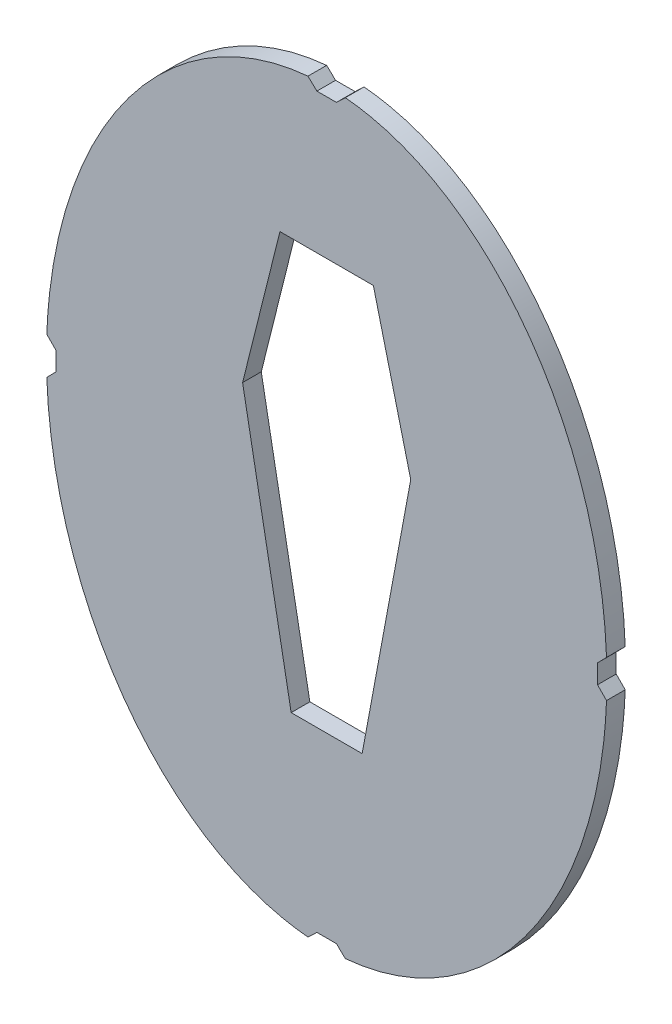
ISO-10303-21;
HEADER;
FILE_DESCRIPTION(('STEP AP214'),'2;1');
FILE_NAME('part.step','',(''),(''),'','','');
FILE_SCHEMA(('AUTOMOTIVE_DESIGN { 1 0 10303 214 1 1 1 1 }'));
ENDSEC;
DATA;
#1=APPLICATION_CONTEXT('core data for automotive mechanical design processes');
#2=APPLICATION_PROTOCOL_DEFINITION('international standard','automotive_design',2000,#1);
#3=PRODUCT_CONTEXT('',#1,'mechanical');
#4=PRODUCT('Part','Part','',(#3));
#5=PRODUCT_RELATED_PRODUCT_CATEGORY('part','',(#4));
#6=PRODUCT_DEFINITION_FORMATION('','',#4);
#7=PRODUCT_DEFINITION_CONTEXT('part definition',#1,'design');
#8=PRODUCT_DEFINITION('design','',#6,#7);
#9=PRODUCT_DEFINITION_SHAPE('','',#8);
#10=(LENGTH_UNIT() NAMED_UNIT(*) SI_UNIT(.MILLI.,.METRE.));
#11=(NAMED_UNIT(*) PLANE_ANGLE_UNIT() SI_UNIT($,.RADIAN.));
#12=(NAMED_UNIT(*) SI_UNIT($,.STERADIAN.) SOLID_ANGLE_UNIT());
#13=UNCERTAINTY_MEASURE_WITH_UNIT(LENGTH_MEASURE(1.E-05),#10,'distance_accuracy_value','');
#14=(GEOMETRIC_REPRESENTATION_CONTEXT(3) GLOBAL_UNCERTAINTY_ASSIGNED_CONTEXT((#13)) GLOBAL_UNIT_ASSIGNED_CONTEXT((#10,
#11,#12)) REPRESENTATION_CONTEXT('',''));
#15=CARTESIAN_POINT('',(0.,0.,0.));
#16=DIRECTION('',(0.,0.,1.));
#17=DIRECTION('',(1.,0.,0.));
#18=AXIS2_PLACEMENT_3D('',#15,#16,#17);
#19=CARTESIAN_POINT('',(0.,0.,1.));
#20=DIRECTION('',(0.,0.,1.));
#21=DIRECTION('',(0.,-1.,0.));
#22=AXIS2_PLACEMENT_3D('',#19,#20,#21);
#23=ELLIPSE('',#22,20.,15.);
#24=DIRECTION('',(0.,0.,-1.));
#25=VECTOR('',#24,1.);
#26=SURFACE_OF_LINEAR_EXTRUSION('',#23,#25);
#27=CARTESIAN_POINT('',(0.,0.,0.));
#28=DIRECTION('',(0.,0.,1.));
#29=DIRECTION('',(0.,-1.,0.));
#30=AXIS2_PLACEMENT_3D('',#27,#28,#29);
#31=ELLIPSE('',#30,20.,15.);
#32=CARTESIAN_POINT('',(0.999942528320215,-19.9555111826307,0.));
#33=VERTEX_POINT('',#32);
#34=CARTESIAN_POINT('',(14.9812379774699,-1.00000769989435,0.));
#35=VERTEX_POINT('',#34);
#36=EDGE_CURVE('E248',#33,#35,#31,.T.);
#37=ORIENTED_EDGE('',*,*,#36,.T.);
#38=DIRECTION('',(0.,0.,-1.));
#39=VECTOR('',#38,1.);
#40=CARTESIAN_POINT('',(14.9812379774699,-1.00000769989435,0.));
#41=LINE('',#40,#39);
#42=CARTESIAN_POINT('',(14.9812379774699,-1.00000769989436,1.));
#43=VERTEX_POINT('',#42);
#44=EDGE_CURVE('E153',#35,#43,#41,.F.);
#45=ORIENTED_EDGE('',*,*,#44,.T.);
#46=CARTESIAN_POINT('',(0.999942528320216,-19.9555111826307,1.));
#47=VERTEX_POINT('',#46);
#48=EDGE_CURVE('E257',#47,#43,#23,.T.);
#49=ORIENTED_EDGE('',*,*,#48,.F.);
#50=DIRECTION('',(0.,0.,-1.));
#51=VECTOR('',#50,1.);
#52=CARTESIAN_POINT('',(0.999942528320216,-19.9555111826307,1.));
#53=LINE('',#52,#51);
#54=EDGE_CURVE('E150',#47,#33,#53,.T.);
#55=ORIENTED_EDGE('',*,*,#54,.T.);
#56=EDGE_LOOP('',(#37,#45,#49,#55));
#57=FACE_BOUND('',#56,.T.);
#58=ADVANCED_FACE('F33',(#57),#26,.F.);
#59=CARTESIAN_POINT('',(-14.9812379774699,-1.00000769989434,1.));
#60=VERTEX_POINT('',#59);
#61=CARTESIAN_POINT('',(-0.999942528320209,-19.9555111826307,1.));
#62=VERTEX_POINT('',#61);
#63=EDGE_CURVE('E254',#60,#62,#23,.T.);
#64=ORIENTED_EDGE('',*,*,#63,.F.);
#65=DIRECTION('',(0.,0.,-1.));
#66=VECTOR('',#65,1.);
#67=CARTESIAN_POINT('',(-14.9812379774699,-1.00000769989434,1.));
#68=LINE('',#67,#66);
#69=CARTESIAN_POINT('',(-14.9812379774699,-1.00000769989434,0.));
#70=VERTEX_POINT('',#69);
#71=EDGE_CURVE('E143',#60,#70,#68,.T.);
#72=ORIENTED_EDGE('',*,*,#71,.T.);
#73=CARTESIAN_POINT('',(-0.999942528320208,-19.9555111826307,0.));
#74=VERTEX_POINT('',#73);
#75=EDGE_CURVE('E237',#70,#74,#31,.T.);
#76=ORIENTED_EDGE('',*,*,#75,.T.);
#77=DIRECTION('',(0.,0.,-1.));
#78=VECTOR('',#77,1.);
#79=CARTESIAN_POINT('',(-0.999942528320209,-19.9555111826307,0.));
#80=LINE('',#79,#78);
#81=EDGE_CURVE('E140',#74,#62,#80,.F.);
#82=ORIENTED_EDGE('',*,*,#81,.T.);
#83=EDGE_LOOP('',(#64,#72,#76,#82));
#84=FACE_BOUND('',#83,.T.);
#85=ADVANCED_FACE('F243',(#84),#26,.F.);
#86=CARTESIAN_POINT('',(-0.999942528320215,19.9555111826307,0.));
#87=VERTEX_POINT('',#86);
#88=CARTESIAN_POINT('',(-14.9812379774699,1.00000769989435,0.));
#89=VERTEX_POINT('',#88);
#90=EDGE_CURVE('E247',#87,#89,#31,.T.);
#91=ORIENTED_EDGE('',*,*,#90,.T.);
#92=DIRECTION('',(0.,0.,-1.));
#93=VECTOR('',#92,1.);
#94=CARTESIAN_POINT('',(-14.9812379774699,1.00000769989435,0.));
#95=LINE('',#94,#93);
#96=CARTESIAN_POINT('',(-14.9812379774699,1.00000769989435,1.));
#97=VERTEX_POINT('',#96);
#98=EDGE_CURVE('E190',#89,#97,#95,.F.);
#99=ORIENTED_EDGE('',*,*,#98,.T.);
#100=CARTESIAN_POINT('',(-0.999942528320216,19.9555111826307,1.));
#101=VERTEX_POINT('',#100);
#102=EDGE_CURVE('E256',#101,#97,#23,.T.);
#103=ORIENTED_EDGE('',*,*,#102,.F.);
#104=DIRECTION('',(0.,0.,-1.));
#105=VECTOR('',#104,1.);
#106=CARTESIAN_POINT('',(-0.999942528320217,19.9555111826307,1.));
#107=LINE('',#106,#105);
#108=EDGE_CURVE('E261',#101,#87,#107,.T.);
#109=ORIENTED_EDGE('',*,*,#108,.T.);
#110=EDGE_LOOP('',(#91,#99,#103,#109));
#111=FACE_BOUND('',#110,.T.);
#112=ADVANCED_FACE('F299',(#111),#26,.F.);
#113=CARTESIAN_POINT('',(14.9812379774699,1.00000769989435,0.));
#114=VERTEX_POINT('',#113);
#115=CARTESIAN_POINT('',(0.99994252832022,19.9555111826307,0.));
#116=VERTEX_POINT('',#115);
#117=EDGE_CURVE('E212',#114,#116,#31,.T.);
#118=ORIENTED_EDGE('',*,*,#117,.T.);
#119=DIRECTION('',(0.,0.,-1.));
#120=VECTOR('',#119,1.);
#121=CARTESIAN_POINT('',(0.99994252832022,19.9555111826307,0.));
#122=LINE('',#121,#120);
#123=CARTESIAN_POINT('',(0.999942528320216,19.9555111826307,1.));
#124=VERTEX_POINT('',#123);
#125=EDGE_CURVE('E128',#116,#124,#122,.F.);
#126=ORIENTED_EDGE('',*,*,#125,.T.);
#127=CARTESIAN_POINT('',(14.9812379774699,1.00000769989435,1.));
#128=VERTEX_POINT('',#127);
#129=EDGE_CURVE('E259',#128,#124,#23,.T.);
#130=ORIENTED_EDGE('',*,*,#129,.F.);
#131=DIRECTION('',(0.,0.,-1.));
#132=VECTOR('',#131,1.);
#133=CARTESIAN_POINT('',(14.9812379774699,1.00000769989435,1.));
#134=LINE('',#133,#132);
#135=EDGE_CURVE('E146',#128,#114,#134,.T.);
#136=ORIENTED_EDGE('',*,*,#135,.T.);
#137=EDGE_LOOP('',(#118,#126,#130,#136));
#138=FACE_BOUND('',#137,.T.);
#139=ADVANCED_FACE('F297',(#138),#26,.F.);
#140=CARTESIAN_POINT('',(0.,0.,1.));
#141=DIRECTION('',(0.,0.,1.));
#142=DIRECTION('',(1.,0.,0.));
#143=AXIS2_PLACEMENT_3D('',#140,#141,#142);
#144=PLANE('',#143);
#145=DIRECTION('',(0.700312876833744,-0.713836027768874,0.));
#146=VECTOR('',#145,1.);
#147=CARTESIAN_POINT('',(-7.13395529530454,-6.99880723542809,1.));
#148=LINE('',#147,#146);
#149=CARTESIAN_POINT('',(-14.5,0.509476941982592,1.));
#150=VERTEX_POINT('',#149);
#151=EDGE_CURVE('E204',#97,#150,#148,.T.);
#152=ORIENTED_EDGE('',*,*,#151,.T.);
#153=DIRECTION('',(0.,1.,0.));
#154=VECTOR('',#153,1.);
#155=CARTESIAN_POINT('',(-14.5,0.500000000000004,1.));
#156=LINE('',#155,#154);
#157=CARTESIAN_POINT('',(-14.5,-0.509476941982587,1.));
#158=VERTEX_POINT('',#157);
#159=EDGE_CURVE('E611',#158,#150,#156,.T.);
#160=ORIENTED_EDGE('',*,*,#159,.F.);
#161=DIRECTION('',(0.700312876833747,0.713836027768872,0.));
#162=VECTOR('',#161,1.);
#163=CARTESIAN_POINT('',(-7.13395529530449,6.99880723542809,1.));
#164=LINE('',#163,#162);
#165=EDGE_CURVE('E201',#158,#60,#164,.F.);
#166=ORIENTED_EDGE('',*,*,#165,.T.);
#167=ORIENTED_EDGE('',*,*,#63,.T.);
#168=DIRECTION('',(0.723299730423161,0.690534213467938,0.));
#169=VECTOR('',#168,1.);
#170=CARTESIAN_POINT('',(9.49023358611655,-9.94054061422642,1.));
#171=LINE('',#170,#169);
#172=CARTESIAN_POINT('',(-0.522817558730489,-19.5,1.));
#173=VERTEX_POINT('',#172);
#174=EDGE_CURVE('E185',#62,#173,#171,.T.);
#175=ORIENTED_EDGE('',*,*,#174,.T.);
#176=DIRECTION('',(-1.,0.,0.));
#177=VECTOR('',#176,1.);
#178=CARTESIAN_POINT('',(-0.5,-19.5,1.));
#179=LINE('',#178,#177);
#180=CARTESIAN_POINT('',(0.522817558730494,-19.5,1.));
#181=VERTEX_POINT('',#180);
#182=EDGE_CURVE('E171',#181,#173,#179,.T.);
#183=ORIENTED_EDGE('',*,*,#182,.F.);
#184=DIRECTION('',(-0.723299730423162,0.690534213467936,0.));
#185=VECTOR('',#184,1.);
#186=CARTESIAN_POINT('',(-9.49023358611655,-9.94054061422645,1.));
#187=LINE('',#186,#185);
#188=EDGE_CURVE('E178',#181,#47,#187,.F.);
#189=ORIENTED_EDGE('',*,*,#188,.T.);
#190=ORIENTED_EDGE('',*,*,#48,.T.);
#191=DIRECTION('',(-0.700312876833745,0.713836027768873,0.));
#192=VECTOR('',#191,1.);
#193=CARTESIAN_POINT('',(7.13395529530451,6.99880723542809,1.));
#194=LINE('',#193,#192);
#195=CARTESIAN_POINT('',(14.5,-0.509476941982599,1.));
#196=VERTEX_POINT('',#195);
#197=EDGE_CURVE('E188',#43,#196,#194,.T.);
#198=ORIENTED_EDGE('',*,*,#197,.T.);
#199=DIRECTION('',(0.,-1.,0.));
#200=VECTOR('',#199,1.);
#201=CARTESIAN_POINT('',(14.5,0.499999999999999,1.));
#202=LINE('',#201,#200);
#203=CARTESIAN_POINT('',(14.5,0.509476941982596,1.));
#204=VERTEX_POINT('',#203);
#205=EDGE_CURVE('E220',#204,#196,#202,.T.);
#206=ORIENTED_EDGE('',*,*,#205,.F.);
#207=DIRECTION('',(-0.700312876833745,-0.713836027768873,0.));
#208=VECTOR('',#207,1.);
#209=CARTESIAN_POINT('',(7.13395529530452,-6.99880723542809,1.));
#210=LINE('',#209,#208);
#211=EDGE_CURVE('E184',#204,#128,#210,.F.);
#212=ORIENTED_EDGE('',*,*,#211,.T.);
#213=ORIENTED_EDGE('',*,*,#129,.T.);
#214=DIRECTION('',(-0.723299730423166,-0.690534213467932,0.));
#215=VECTOR('',#214,1.);
#216=CARTESIAN_POINT('',(-9.49023358611655,9.94054061422656,1.));
#217=LINE('',#216,#215);
#218=CARTESIAN_POINT('',(0.522817558730493,19.5,1.));
#219=VERTEX_POINT('',#218);
#220=EDGE_CURVE('E196',#124,#219,#217,.T.);
#221=ORIENTED_EDGE('',*,*,#220,.T.);
#222=DIRECTION('',(1.,0.,0.));
#223=VECTOR('',#222,1.);
#224=CARTESIAN_POINT('',(-0.499999999999998,19.5,1.));
#225=LINE('',#224,#223);
#226=CARTESIAN_POINT('',(-0.522817558730493,19.5,1.));
#227=VERTEX_POINT('',#226);
#228=EDGE_CURVE('E113',#227,#219,#225,.T.);
#229=ORIENTED_EDGE('',*,*,#228,.F.);
#230=DIRECTION('',(0.723299730423163,-0.690534213467935,0.));
#231=VECTOR('',#230,1.);
#232=CARTESIAN_POINT('',(9.49023358611655,9.94054061422649,1.));
#233=LINE('',#232,#231);
#234=EDGE_CURVE('E198',#227,#101,#233,.F.);
#235=ORIENTED_EDGE('',*,*,#234,.T.);
#236=ORIENTED_EDGE('',*,*,#102,.T.);
#237=EDGE_LOOP('',(#152,#160,#166,#167,#175,#183,#189,#190,#198,#206,#212,#213,#221,#229,#235,#236));
#238=FACE_BOUND('',#237,.T.);
#239=DIRECTION('',(-0.242535625036333,-0.970142500145332,0.));
#240=VECTOR('',#239,1.);
#241=CARTESIAN_POINT('',(-2.49999999999999,12.,1.));
#242=LINE('',#241,#240);
#243=CARTESIAN_POINT('',(-2.49999999999999,12.,1.));
#244=VERTEX_POINT('',#243);
#245=CARTESIAN_POINT('',(-4.49999999999999,4.,1.));
#246=VERTEX_POINT('',#245);
#247=EDGE_CURVE('E112',#244,#246,#242,.T.);
#248=ORIENTED_EDGE('',*,*,#247,.F.);
#249=DIRECTION('',(-1.,0.,0.));
#250=VECTOR('',#249,1.);
#251=CARTESIAN_POINT('',(2.49999999999999,12.,1.));
#252=LINE('',#251,#250);
#253=CARTESIAN_POINT('',(2.49999999999999,12.,1.));
#254=VERTEX_POINT('',#253);
#255=EDGE_CURVE('E513',#254,#244,#252,.T.);
#256=ORIENTED_EDGE('',*,*,#255,.F.);
#257=DIRECTION('',(-0.242535625036333,0.970142500145332,0.));
#258=VECTOR('',#257,1.);
#259=CARTESIAN_POINT('',(2.49999999999999,12.,1.));
#260=LINE('',#259,#258);
#261=CARTESIAN_POINT('',(4.49999999999999,4.,1.));
#262=VERTEX_POINT('',#261);
#263=EDGE_CURVE('E516',#262,#254,#260,.T.);
#264=ORIENTED_EDGE('',*,*,#263,.F.);
#265=DIRECTION('',(0.182592193842776,0.983188736076488,0.));
#266=VECTOR('',#265,1.);
#267=CARTESIAN_POINT('',(1.9,-10.,1.));
#268=LINE('',#267,#266);
#269=CARTESIAN_POINT('',(1.9,-10.,1.));
#270=VERTEX_POINT('',#269);
#271=EDGE_CURVE('E533',#270,#262,#268,.T.);
#272=ORIENTED_EDGE('',*,*,#271,.F.);
#273=DIRECTION('',(1.,0.,0.));
#274=VECTOR('',#273,1.);
#275=CARTESIAN_POINT('',(-1.9,-10.,1.));
#276=LINE('',#275,#274);
#277=CARTESIAN_POINT('',(-1.9,-10.,1.));
#278=VERTEX_POINT('',#277);
#279=EDGE_CURVE('E530',#278,#270,#276,.T.);
#280=ORIENTED_EDGE('',*,*,#279,.F.);
#281=DIRECTION('',(0.182592193842776,-0.983188736076488,0.));
#282=VECTOR('',#281,1.);
#283=CARTESIAN_POINT('',(-1.9,-10.,1.));
#284=LINE('',#283,#282);
#285=EDGE_CURVE('E528',#246,#278,#284,.T.);
#286=ORIENTED_EDGE('',*,*,#285,.F.);
#287=EDGE_LOOP('',(#248,#256,#264,#272,#280,#286));
#288=FACE_BOUND('',#287,.T.);
#289=ADVANCED_FACE('F252',(#238,#288),#144,.T.);
#290=CARTESIAN_POINT('',(0.,0.,0.));
#291=DIRECTION('',(0.,0.,1.));
#292=DIRECTION('',(1.,0.,0.));
#293=AXIS2_PLACEMENT_3D('',#290,#291,#292);
#294=PLANE('',#293);
#295=DIRECTION('',(0.,1.,0.));
#296=VECTOR('',#295,1.);
#297=CARTESIAN_POINT('',(-14.5,0.500000000000004,0.));
#298=LINE('',#297,#296);
#299=CARTESIAN_POINT('',(-14.5,-0.509476941982587,0.));
#300=VERTEX_POINT('',#299);
#301=CARTESIAN_POINT('',(-14.5,0.509476941982592,0.));
#302=VERTEX_POINT('',#301);
#303=EDGE_CURVE('E50',#300,#302,#298,.T.);
#304=ORIENTED_EDGE('',*,*,#303,.T.);
#305=DIRECTION('',(-0.700312876833744,0.713836027768874,0.));
#306=VECTOR('',#305,1.);
#307=CARTESIAN_POINT('',(-14.9812379774699,1.00000769989435,0.));
#308=LINE('',#307,#306);
#309=EDGE_CURVE('E138',#302,#89,#308,.T.);
#310=ORIENTED_EDGE('',*,*,#309,.T.);
#311=ORIENTED_EDGE('',*,*,#90,.F.);
#312=DIRECTION('',(-0.723299730423163,0.690534213467935,0.));
#313=VECTOR('',#312,1.);
#314=CARTESIAN_POINT('',(-0.999942528320217,19.9555111826307,0.));
#315=LINE('',#314,#313);
#316=CARTESIAN_POINT('',(-0.522817558730493,19.5,0.));
#317=VERTEX_POINT('',#316);
#318=EDGE_CURVE('E108',#87,#317,#315,.F.);
#319=ORIENTED_EDGE('',*,*,#318,.T.);
#320=DIRECTION('',(1.,0.,0.));
#321=VECTOR('',#320,1.);
#322=CARTESIAN_POINT('',(-0.499999999999998,19.5,0.));
#323=LINE('',#322,#321);
#324=CARTESIAN_POINT('',(0.522817558730493,19.5,0.));
#325=VERTEX_POINT('',#324);
#326=EDGE_CURVE('E98',#317,#325,#323,.T.);
#327=ORIENTED_EDGE('',*,*,#326,.T.);
#328=DIRECTION('',(0.723299730423166,0.690534213467932,0.));
#329=VECTOR('',#328,1.);
#330=CARTESIAN_POINT('',(0.99994252832022,19.9555111826307,0.));
#331=LINE('',#330,#329);
#332=EDGE_CURVE('E104',#325,#116,#331,.T.);
#333=ORIENTED_EDGE('',*,*,#332,.T.);
#334=ORIENTED_EDGE('',*,*,#117,.F.);
#335=DIRECTION('',(0.700312876833745,0.713836027768873,0.));
#336=VECTOR('',#335,1.);
#337=CARTESIAN_POINT('',(14.9812379774699,1.00000769989435,0.));
#338=LINE('',#337,#336);
#339=CARTESIAN_POINT('',(14.5,0.509476941982596,0.));
#340=VERTEX_POINT('',#339);
#341=EDGE_CURVE('E133',#114,#340,#338,.F.);
#342=ORIENTED_EDGE('',*,*,#341,.T.);
#343=DIRECTION('',(0.,-1.,0.));
#344=VECTOR('',#343,1.);
#345=CARTESIAN_POINT('',(14.5,0.499999999999999,0.));
#346=LINE('',#345,#344);
#347=CARTESIAN_POINT('',(14.5,-0.509476941982599,0.));
#348=VERTEX_POINT('',#347);
#349=EDGE_CURVE('E94',#340,#348,#346,.T.);
#350=ORIENTED_EDGE('',*,*,#349,.T.);
#351=DIRECTION('',(0.700312876833745,-0.713836027768873,0.));
#352=VECTOR('',#351,1.);
#353=CARTESIAN_POINT('',(14.9812379774699,-1.00000769989435,0.));
#354=LINE('',#353,#352);
#355=EDGE_CURVE('E129',#348,#35,#354,.T.);
#356=ORIENTED_EDGE('',*,*,#355,.T.);
#357=ORIENTED_EDGE('',*,*,#36,.F.);
#358=DIRECTION('',(0.723299730423162,-0.690534213467936,0.));
#359=VECTOR('',#358,1.);
#360=CARTESIAN_POINT('',(0.999942528320216,-19.9555111826307,0.));
#361=LINE('',#360,#359);
#362=CARTESIAN_POINT('',(0.522817558730494,-19.5,0.));
#363=VERTEX_POINT('',#362);
#364=EDGE_CURVE('E209',#33,#363,#361,.F.);
#365=ORIENTED_EDGE('',*,*,#364,.T.);
#366=DIRECTION('',(-1.,0.,0.));
#367=VECTOR('',#366,1.);
#368=CARTESIAN_POINT('',(-0.5,-19.5,0.));
#369=LINE('',#368,#367);
#370=CARTESIAN_POINT('',(-0.522817558730489,-19.5,0.));
#371=VERTEX_POINT('',#370);
#372=EDGE_CURVE('E82',#363,#371,#369,.T.);
#373=ORIENTED_EDGE('',*,*,#372,.T.);
#374=DIRECTION('',(-0.723299730423161,-0.690534213467938,0.));
#375=VECTOR('',#374,1.);
#376=CARTESIAN_POINT('',(-0.999942528320209,-19.9555111826307,0.));
#377=LINE('',#376,#375);
#378=EDGE_CURVE('E207',#371,#74,#377,.T.);
#379=ORIENTED_EDGE('',*,*,#378,.T.);
#380=ORIENTED_EDGE('',*,*,#75,.F.);
#381=DIRECTION('',(-0.700312876833747,-0.713836027768872,0.));
#382=VECTOR('',#381,1.);
#383=CARTESIAN_POINT('',(-14.9812379774699,-1.00000769989434,0.));
#384=LINE('',#383,#382);
#385=EDGE_CURVE('E131',#70,#300,#384,.F.);
#386=ORIENTED_EDGE('',*,*,#385,.T.);
#387=EDGE_LOOP('',(#304,#310,#311,#319,#327,#333,#334,#342,#350,#356,#357,#365,#373,#379,#380,#386));
#388=FACE_BOUND('',#387,.T.);
#389=DIRECTION('',(-1.,0.,0.));
#390=VECTOR('',#389,1.);
#391=CARTESIAN_POINT('',(2.49999999999999,12.,0.));
#392=LINE('',#391,#390);
#393=CARTESIAN_POINT('',(2.49999999999999,12.,0.));
#394=VERTEX_POINT('',#393);
#395=CARTESIAN_POINT('',(-2.49999999999999,12.,0.));
#396=VERTEX_POINT('',#395);
#397=EDGE_CURVE('E504',#394,#396,#392,.T.);
#398=ORIENTED_EDGE('',*,*,#397,.T.);
#399=DIRECTION('',(-0.242535625036333,-0.970142500145332,0.));
#400=VECTOR('',#399,1.);
#401=CARTESIAN_POINT('',(-2.49999999999999,12.,0.));
#402=LINE('',#401,#400);
#403=CARTESIAN_POINT('',(-4.49999999999999,4.,0.));
#404=VERTEX_POINT('',#403);
#405=EDGE_CURVE('E497',#396,#404,#402,.T.);
#406=ORIENTED_EDGE('',*,*,#405,.T.);
#407=DIRECTION('',(0.182592193842776,-0.983188736076488,0.));
#408=VECTOR('',#407,1.);
#409=CARTESIAN_POINT('',(-1.9,-10.,0.));
#410=LINE('',#409,#408);
#411=CARTESIAN_POINT('',(-1.9,-10.,0.));
#412=VERTEX_POINT('',#411);
#413=EDGE_CURVE('E507',#404,#412,#410,.T.);
#414=ORIENTED_EDGE('',*,*,#413,.T.);
#415=DIRECTION('',(1.,0.,0.));
#416=VECTOR('',#415,1.);
#417=CARTESIAN_POINT('',(-1.9,-10.,0.));
#418=LINE('',#417,#416);
#419=CARTESIAN_POINT('',(1.9,-10.,0.));
#420=VERTEX_POINT('',#419);
#421=EDGE_CURVE('E509',#412,#420,#418,.T.);
#422=ORIENTED_EDGE('',*,*,#421,.T.);
#423=DIRECTION('',(0.182592193842776,0.983188736076488,0.));
#424=VECTOR('',#423,1.);
#425=CARTESIAN_POINT('',(1.9,-10.,0.));
#426=LINE('',#425,#424);
#427=CARTESIAN_POINT('',(4.49999999999999,4.,0.));
#428=VERTEX_POINT('',#427);
#429=EDGE_CURVE('E521',#420,#428,#426,.T.);
#430=ORIENTED_EDGE('',*,*,#429,.T.);
#431=DIRECTION('',(-0.242535625036333,0.970142500145332,0.));
#432=VECTOR('',#431,1.);
#433=CARTESIAN_POINT('',(2.49999999999999,12.,0.));
#434=LINE('',#433,#432);
#435=EDGE_CURVE('E524',#428,#394,#434,.T.);
#436=ORIENTED_EDGE('',*,*,#435,.T.);
#437=EDGE_LOOP('',(#398,#406,#414,#422,#430,#436));
#438=FACE_BOUND('',#437,.T.);
#439=ADVANCED_FACE('F100',(#388,#438),#294,.F.);
#440=CARTESIAN_POINT('',(-2.49999999999999,12.,0.));
#441=DIRECTION('',(-0.970142500145332,0.242535625036333,0.));
#442=DIRECTION('',(-0.242535625036333,-0.970142500145332,0.));
#443=AXIS2_PLACEMENT_3D('',#440,#441,#442);
#444=PLANE('',#443);
#445=ORIENTED_EDGE('',*,*,#247,.T.);
#446=DIRECTION('',(0.,0.,1.));
#447=VECTOR('',#446,1.);
#448=CARTESIAN_POINT('',(-4.49999999999999,4.,0.));
#449=LINE('',#448,#447);
#450=EDGE_CURVE('E494',#404,#246,#449,.T.);
#451=ORIENTED_EDGE('',*,*,#450,.F.);
#452=ORIENTED_EDGE('',*,*,#405,.F.);
#453=DIRECTION('',(0.,0.,1.));
#454=VECTOR('',#453,1.);
#455=CARTESIAN_POINT('',(-2.49999999999999,12.,0.));
#456=LINE('',#455,#454);
#457=EDGE_CURVE('E274',#396,#244,#456,.T.);
#458=ORIENTED_EDGE('',*,*,#457,.T.);
#459=EDGE_LOOP('',(#445,#451,#452,#458));
#460=FACE_BOUND('',#459,.T.);
#461=ADVANCED_FACE('F338',(#460),#444,.F.);
#462=CARTESIAN_POINT('',(2.49999999999999,12.,0.));
#463=DIRECTION('',(0.,1.,0.));
#464=DIRECTION('',(0.,0.,1.));
#465=AXIS2_PLACEMENT_3D('',#462,#463,#464);
#466=PLANE('',#465);
#467=ORIENTED_EDGE('',*,*,#255,.T.);
#468=ORIENTED_EDGE('',*,*,#457,.F.);
#469=ORIENTED_EDGE('',*,*,#397,.F.);
#470=DIRECTION('',(0.,0.,1.));
#471=VECTOR('',#470,1.);
#472=CARTESIAN_POINT('',(2.49999999999999,12.,0.));
#473=LINE('',#472,#471);
#474=EDGE_CURVE('E539',#394,#254,#473,.T.);
#475=ORIENTED_EDGE('',*,*,#474,.T.);
#476=EDGE_LOOP('',(#467,#468,#469,#475));
#477=FACE_BOUND('',#476,.T.);
#478=ADVANCED_FACE('F558',(#477),#466,.F.);
#479=CARTESIAN_POINT('',(2.49999999999999,12.,0.));
#480=DIRECTION('',(0.970142500145332,0.242535625036333,0.));
#481=DIRECTION('',(-0.242535625036333,0.970142500145332,0.));
#482=AXIS2_PLACEMENT_3D('',#479,#480,#481);
#483=PLANE('',#482);
#484=ORIENTED_EDGE('',*,*,#263,.T.);
#485=ORIENTED_EDGE('',*,*,#474,.F.);
#486=ORIENTED_EDGE('',*,*,#435,.F.);
#487=DIRECTION('',(0.,0.,1.));
#488=VECTOR('',#487,1.);
#489=CARTESIAN_POINT('',(4.49999999999999,4.,0.));
#490=LINE('',#489,#488);
#491=EDGE_CURVE('E541',#428,#262,#490,.T.);
#492=ORIENTED_EDGE('',*,*,#491,.T.);
#493=EDGE_LOOP('',(#484,#485,#486,#492));
#494=FACE_BOUND('',#493,.T.);
#495=ADVANCED_FACE('F556',(#494),#483,.F.);
#496=CARTESIAN_POINT('',(1.9,-10.,0.));
#497=DIRECTION('',(0.983188736076488,-0.182592193842776,0.));
#498=DIRECTION('',(0.182592193842776,0.983188736076488,0.));
#499=AXIS2_PLACEMENT_3D('',#496,#497,#498);
#500=PLANE('',#499);
#501=ORIENTED_EDGE('',*,*,#271,.T.);
#502=ORIENTED_EDGE('',*,*,#491,.F.);
#503=ORIENTED_EDGE('',*,*,#429,.F.);
#504=DIRECTION('',(0.,0.,1.));
#505=VECTOR('',#504,1.);
#506=CARTESIAN_POINT('',(1.9,-10.,0.));
#507=LINE('',#506,#505);
#508=EDGE_CURVE('E543',#420,#270,#507,.T.);
#509=ORIENTED_EDGE('',*,*,#508,.T.);
#510=EDGE_LOOP('',(#501,#502,#503,#509));
#511=FACE_BOUND('',#510,.T.);
#512=ADVANCED_FACE('F552',(#511),#500,.F.);
#513=CARTESIAN_POINT('',(-1.9,-10.,0.));
#514=DIRECTION('',(0.,-1.,0.));
#515=DIRECTION('',(0.,0.,-1.));
#516=AXIS2_PLACEMENT_3D('',#513,#514,#515);
#517=PLANE('',#516);
#518=ORIENTED_EDGE('',*,*,#279,.T.);
#519=ORIENTED_EDGE('',*,*,#508,.F.);
#520=ORIENTED_EDGE('',*,*,#421,.F.);
#521=DIRECTION('',(0.,0.,1.));
#522=VECTOR('',#521,1.);
#523=CARTESIAN_POINT('',(-1.9,-10.,0.));
#524=LINE('',#523,#522);
#525=EDGE_CURVE('E503',#412,#278,#524,.T.);
#526=ORIENTED_EDGE('',*,*,#525,.T.);
#527=EDGE_LOOP('',(#518,#519,#520,#526));
#528=FACE_BOUND('',#527,.T.);
#529=ADVANCED_FACE('F546',(#528),#517,.F.);
#530=CARTESIAN_POINT('',(-1.9,-10.,0.));
#531=DIRECTION('',(-0.983188736076488,-0.182592193842776,0.));
#532=DIRECTION('',(0.182592193842776,-0.983188736076488,0.));
#533=AXIS2_PLACEMENT_3D('',#530,#531,#532);
#534=PLANE('',#533);
#535=ORIENTED_EDGE('',*,*,#285,.T.);
#536=ORIENTED_EDGE('',*,*,#525,.F.);
#537=ORIENTED_EDGE('',*,*,#413,.F.);
#538=ORIENTED_EDGE('',*,*,#450,.T.);
#539=EDGE_LOOP('',(#535,#536,#537,#538));
#540=FACE_BOUND('',#539,.T.);
#541=ADVANCED_FACE('F348',(#540),#534,.F.);
#542=CARTESIAN_POINT('',(-0.499999999999998,19.5,0.));
#543=DIRECTION('',(0.,-1.,0.));
#544=DIRECTION('',(0.,0.,-1.));
#545=AXIS2_PLACEMENT_3D('',#542,#543,#544);
#546=PLANE('',#545);
#547=ORIENTED_EDGE('',*,*,#228,.T.);
#548=DIRECTION('',(0.,0.,-1.));
#549=VECTOR('',#548,1.);
#550=CARTESIAN_POINT('',(0.522817558730493,19.5,0.));
#551=LINE('',#550,#549);
#552=EDGE_CURVE('E116',#219,#325,#551,.T.);
#553=ORIENTED_EDGE('',*,*,#552,.T.);
#554=ORIENTED_EDGE('',*,*,#326,.F.);
#555=DIRECTION('',(0.,0.,-1.));
#556=VECTOR('',#555,1.);
#557=CARTESIAN_POINT('',(-0.522817558730493,19.5,0.));
#558=LINE('',#557,#556);
#559=EDGE_CURVE('E123',#317,#227,#558,.F.);
#560=ORIENTED_EDGE('',*,*,#559,.T.);
#561=EDGE_LOOP('',(#547,#553,#554,#560));
#562=FACE_BOUND('',#561,.T.);
#563=ADVANCED_FACE('F117',(#562),#546,.F.);
#564=CARTESIAN_POINT('',(14.5,0.499999999999999,0.));
#565=DIRECTION('',(-1.,0.,0.));
#566=DIRECTION('',(0.,0.,1.));
#567=AXIS2_PLACEMENT_3D('',#564,#565,#566);
#568=PLANE('',#567);
#569=ORIENTED_EDGE('',*,*,#205,.T.);
#570=DIRECTION('',(0.,0.,-1.));
#571=VECTOR('',#570,1.);
#572=CARTESIAN_POINT('',(14.5,-0.509476941982599,0.));
#573=LINE('',#572,#571);
#574=EDGE_CURVE('E122',#196,#348,#573,.T.);
#575=ORIENTED_EDGE('',*,*,#574,.T.);
#576=ORIENTED_EDGE('',*,*,#349,.F.);
#577=DIRECTION('',(0.,0.,-1.));
#578=VECTOR('',#577,1.);
#579=CARTESIAN_POINT('',(14.5,0.509476941982596,0.));
#580=LINE('',#579,#578);
#581=EDGE_CURVE('E163',#340,#204,#580,.F.);
#582=ORIENTED_EDGE('',*,*,#581,.T.);
#583=EDGE_LOOP('',(#569,#575,#576,#582));
#584=FACE_BOUND('',#583,.T.);
#585=ADVANCED_FACE('F218',(#584),#568,.F.);
#586=CARTESIAN_POINT('',(-14.5,0.500000000000004,0.));
#587=DIRECTION('',(1.,0.,0.));
#588=DIRECTION('',(0.,0.,-1.));
#589=AXIS2_PLACEMENT_3D('',#586,#587,#588);
#590=PLANE('',#589);
#591=ORIENTED_EDGE('',*,*,#159,.T.);
#592=DIRECTION('',(0.,0.,-1.));
#593=VECTOR('',#592,1.);
#594=CARTESIAN_POINT('',(-14.5,0.509476941982592,0.));
#595=LINE('',#594,#593);
#596=EDGE_CURVE('E156',#150,#302,#595,.T.);
#597=ORIENTED_EDGE('',*,*,#596,.T.);
#598=ORIENTED_EDGE('',*,*,#303,.F.);
#599=DIRECTION('',(0.,0.,-1.));
#600=VECTOR('',#599,1.);
#601=CARTESIAN_POINT('',(-14.5,-0.509476941982587,0.));
#602=LINE('',#601,#600);
#603=EDGE_CURVE('E158',#300,#158,#602,.F.);
#604=ORIENTED_EDGE('',*,*,#603,.T.);
#605=EDGE_LOOP('',(#591,#597,#598,#604));
#606=FACE_BOUND('',#605,.T.);
#607=ADVANCED_FACE('F359',(#606),#590,.F.);
#608=CARTESIAN_POINT('',(-0.5,-19.5,0.));
#609=DIRECTION('',(0.,1.,0.));
#610=DIRECTION('',(0.,0.,1.));
#611=AXIS2_PLACEMENT_3D('',#608,#609,#610);
#612=PLANE('',#611);
#613=ORIENTED_EDGE('',*,*,#182,.T.);
#614=DIRECTION('',(0.,0.,-1.));
#615=VECTOR('',#614,1.);
#616=CARTESIAN_POINT('',(-0.522817558730489,-19.5,0.));
#617=LINE('',#616,#615);
#618=EDGE_CURVE('E11',#173,#371,#617,.T.);
#619=ORIENTED_EDGE('',*,*,#618,.T.);
#620=ORIENTED_EDGE('',*,*,#372,.F.);
#621=DIRECTION('',(0.,0.,-1.));
#622=VECTOR('',#621,1.);
#623=CARTESIAN_POINT('',(0.522817558730494,-19.5,0.));
#624=LINE('',#623,#622);
#625=EDGE_CURVE('E42',#363,#181,#624,.F.);
#626=ORIENTED_EDGE('',*,*,#625,.T.);
#627=EDGE_LOOP('',(#613,#619,#620,#626));
#628=FACE_BOUND('',#627,.T.);
#629=ADVANCED_FACE('F169',(#628),#612,.F.);
#630=CARTESIAN_POINT('',(-14.9812379774699,1.00000769989435,0.5));
#631=DIRECTION('',(-0.713836027768874,-0.700312876833744,0.));
#632=DIRECTION('',(0.,0.,-1.));
#633=AXIS2_PLACEMENT_3D('',#630,#631,#632);
#634=PLANE('',#633);
#635=ORIENTED_EDGE('',*,*,#309,.F.);
#636=ORIENTED_EDGE('',*,*,#596,.F.);
#637=ORIENTED_EDGE('',*,*,#151,.F.);
#638=ORIENTED_EDGE('',*,*,#98,.F.);
#639=EDGE_LOOP('',(#635,#636,#637,#638));
#640=FACE_BOUND('',#639,.T.);
#641=ADVANCED_FACE('F377',(#640),#634,.T.);
#642=CARTESIAN_POINT('',(-14.9812379774699,-1.00000769989434,0.5));
#643=DIRECTION('',(0.713836027768872,-0.700312876833747,0.));
#644=DIRECTION('',(0.,0.,-1.));
#645=AXIS2_PLACEMENT_3D('',#642,#643,#644);
#646=PLANE('',#645);
#647=ORIENTED_EDGE('',*,*,#165,.F.);
#648=ORIENTED_EDGE('',*,*,#603,.F.);
#649=ORIENTED_EDGE('',*,*,#385,.F.);
#650=ORIENTED_EDGE('',*,*,#71,.F.);
#651=EDGE_LOOP('',(#647,#648,#649,#650));
#652=FACE_BOUND('',#651,.T.);
#653=ADVANCED_FACE('F386',(#652),#646,.F.);
#654=CARTESIAN_POINT('',(-0.999942528320217,19.9555111826307,0.5));
#655=DIRECTION('',(-0.690534213467935,-0.723299730423163,0.));
#656=DIRECTION('',(0.,0.,-1.));
#657=AXIS2_PLACEMENT_3D('',#654,#655,#656);
#658=PLANE('',#657);
#659=ORIENTED_EDGE('',*,*,#234,.F.);
#660=ORIENTED_EDGE('',*,*,#559,.F.);
#661=ORIENTED_EDGE('',*,*,#318,.F.);
#662=ORIENTED_EDGE('',*,*,#108,.F.);
#663=EDGE_LOOP('',(#659,#660,#661,#662));
#664=FACE_BOUND('',#663,.T.);
#665=ADVANCED_FACE('F395',(#664),#658,.F.);
#666=CARTESIAN_POINT('',(0.99994252832022,19.9555111826307,0.5));
#667=DIRECTION('',(-0.690534213467932,0.723299730423166,0.));
#668=DIRECTION('',(0.,0.,-1.));
#669=AXIS2_PLACEMENT_3D('',#666,#667,#668);
#670=PLANE('',#669);
#671=ORIENTED_EDGE('',*,*,#332,.F.);
#672=ORIENTED_EDGE('',*,*,#552,.F.);
#673=ORIENTED_EDGE('',*,*,#220,.F.);
#674=ORIENTED_EDGE('',*,*,#125,.F.);
#675=EDGE_LOOP('',(#671,#672,#673,#674));
#676=FACE_BOUND('',#675,.T.);
#677=ADVANCED_FACE('F126',(#676),#670,.T.);
#678=CARTESIAN_POINT('',(14.9812379774699,-1.00000769989435,0.5));
#679=DIRECTION('',(0.713836027768873,0.700312876833745,0.));
#680=DIRECTION('',(0.,0.,-1.));
#681=AXIS2_PLACEMENT_3D('',#678,#679,#680);
#682=PLANE('',#681);
#683=ORIENTED_EDGE('',*,*,#355,.F.);
#684=ORIENTED_EDGE('',*,*,#574,.F.);
#685=ORIENTED_EDGE('',*,*,#197,.F.);
#686=ORIENTED_EDGE('',*,*,#44,.F.);
#687=EDGE_LOOP('',(#683,#684,#685,#686));
#688=FACE_BOUND('',#687,.T.);
#689=ADVANCED_FACE('F283',(#688),#682,.T.);
#690=CARTESIAN_POINT('',(14.9812379774699,1.00000769989435,0.5));
#691=DIRECTION('',(-0.713836027768873,0.700312876833745,0.));
#692=DIRECTION('',(0.,0.,-1.));
#693=AXIS2_PLACEMENT_3D('',#690,#691,#692);
#694=PLANE('',#693);
#695=ORIENTED_EDGE('',*,*,#211,.F.);
#696=ORIENTED_EDGE('',*,*,#581,.F.);
#697=ORIENTED_EDGE('',*,*,#341,.F.);
#698=ORIENTED_EDGE('',*,*,#135,.F.);
#699=EDGE_LOOP('',(#695,#696,#697,#698));
#700=FACE_BOUND('',#699,.T.);
#701=ADVANCED_FACE('F216',(#700),#694,.F.);
#702=CARTESIAN_POINT('',(0.999942528320216,-19.9555111826307,0.5));
#703=DIRECTION('',(0.690534213467936,0.723299730423162,0.));
#704=DIRECTION('',(0.,0.,-1.));
#705=AXIS2_PLACEMENT_3D('',#702,#703,#704);
#706=PLANE('',#705);
#707=ORIENTED_EDGE('',*,*,#188,.F.);
#708=ORIENTED_EDGE('',*,*,#625,.F.);
#709=ORIENTED_EDGE('',*,*,#364,.F.);
#710=ORIENTED_EDGE('',*,*,#54,.F.);
#711=EDGE_LOOP('',(#707,#708,#709,#710));
#712=FACE_BOUND('',#711,.T.);
#713=ADVANCED_FACE('F179',(#712),#706,.F.);
#714=CARTESIAN_POINT('',(-0.999942528320209,-19.9555111826307,0.5));
#715=DIRECTION('',(0.690534213467938,-0.723299730423161,0.));
#716=DIRECTION('',(0.,0.,-1.));
#717=AXIS2_PLACEMENT_3D('',#714,#715,#716);
#718=PLANE('',#717);
#719=ORIENTED_EDGE('',*,*,#378,.F.);
#720=ORIENTED_EDGE('',*,*,#618,.F.);
#721=ORIENTED_EDGE('',*,*,#174,.F.);
#722=ORIENTED_EDGE('',*,*,#81,.F.);
#723=EDGE_LOOP('',(#719,#720,#721,#722));
#724=FACE_BOUND('',#723,.T.);
#725=ADVANCED_FACE('F35',(#724),#718,.T.);
#726=CLOSED_SHELL('',(#58,#85,#112,#139,#289,#439,#461,#478,#495,#512,#529,#541,#563,#585,#607,
#629,#641,#653,#665,#677,#689,#701,#713,#725));
#727=MANIFOLD_SOLID_BREP('B2',#726);
#728=ADVANCED_BREP_SHAPE_REPRESENTATION('',(#18,#727),#14);
#729=SHAPE_DEFINITION_REPRESENTATION(#9,#728);
ENDSEC;
END-ISO-10303-21;
